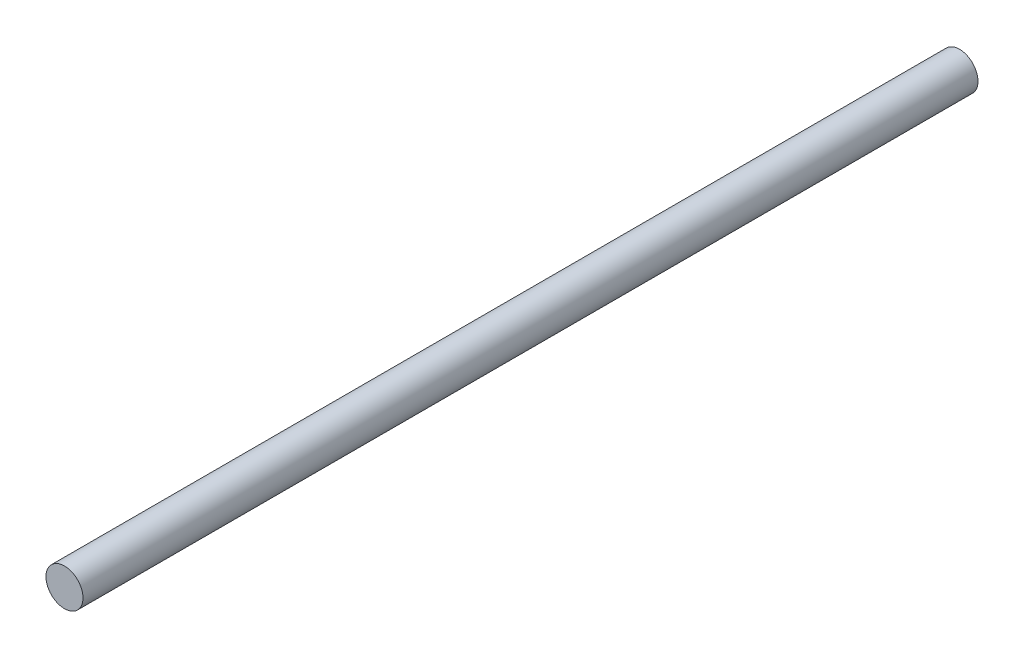
ISO-10303-21;
HEADER;
FILE_DESCRIPTION(('STEP AP214'),'2;1');
FILE_NAME('part.step','',(''),(''),'','','');
FILE_SCHEMA(('AUTOMOTIVE_DESIGN { 1 0 10303 214 1 1 1 1 }'));
ENDSEC;
DATA;
#1=APPLICATION_CONTEXT('core data for automotive mechanical design processes');
#2=APPLICATION_PROTOCOL_DEFINITION('international standard','automotive_design',2000,#1);
#3=PRODUCT_CONTEXT('',#1,'mechanical');
#4=PRODUCT('Part','Part','',(#3));
#5=PRODUCT_RELATED_PRODUCT_CATEGORY('part','',(#4));
#6=PRODUCT_DEFINITION_FORMATION('','',#4);
#7=PRODUCT_DEFINITION_CONTEXT('part definition',#1,'design');
#8=PRODUCT_DEFINITION('design','',#6,#7);
#9=PRODUCT_DEFINITION_SHAPE('','',#8);
#10=(LENGTH_UNIT() NAMED_UNIT(*) SI_UNIT(.MILLI.,.METRE.));
#11=(NAMED_UNIT(*) PLANE_ANGLE_UNIT() SI_UNIT($,.RADIAN.));
#12=(NAMED_UNIT(*) SI_UNIT($,.STERADIAN.) SOLID_ANGLE_UNIT());
#13=UNCERTAINTY_MEASURE_WITH_UNIT(LENGTH_MEASURE(1.E-05),#10,'distance_accuracy_value','');
#14=(GEOMETRIC_REPRESENTATION_CONTEXT(3) GLOBAL_UNCERTAINTY_ASSIGNED_CONTEXT((#13)) GLOBAL_UNIT_ASSIGNED_CONTEXT((#10,
#11,#12)) REPRESENTATION_CONTEXT('',''));
#15=CARTESIAN_POINT('',(0.,0.,0.));
#16=DIRECTION('',(0.,0.,1.));
#17=DIRECTION('',(1.,0.,0.));
#18=AXIS2_PLACEMENT_3D('',#15,#16,#17);
#19=CARTESIAN_POINT('',(0.,0.,290.));
#20=DIRECTION('',(0.,0.,-1.));
#21=DIRECTION('',(-1.,0.,0.));
#22=AXIS2_PLACEMENT_3D('',#19,#20,#21);
#23=CYLINDRICAL_SURFACE('',#22,6.);
#24=CARTESIAN_POINT('',(0.,0.,290.));
#25=DIRECTION('',(0.,0.,1.));
#26=DIRECTION('',(1.,0.,0.));
#27=AXIS2_PLACEMENT_3D('',#24,#25,#26);
#28=CIRCLE('',#27,6.);
#29=CARTESIAN_POINT('',(6.,0.,290.));
#30=VERTEX_POINT('',#29);
#31=EDGE_CURVE('E10',#30,#30,#28,.T.);
#32=ORIENTED_EDGE('',*,*,#31,.F.);
#33=EDGE_LOOP('',(#32));
#34=FACE_BOUND('',#33,.T.);
#35=CARTESIAN_POINT('',(0.,0.,0.));
#36=DIRECTION('',(0.,0.,1.));
#37=DIRECTION('',(1.,0.,0.));
#38=AXIS2_PLACEMENT_3D('',#35,#36,#37);
#39=CIRCLE('',#38,6.);
#40=CARTESIAN_POINT('',(6.,0.,0.));
#41=VERTEX_POINT('',#40);
#42=EDGE_CURVE('E40',#41,#41,#39,.T.);
#43=ORIENTED_EDGE('',*,*,#42,.T.);
#44=EDGE_LOOP('',(#43));
#45=FACE_BOUND('',#44,.T.);
#46=ADVANCED_FACE('F37',(#34,#45),#23,.T.);
#47=CARTESIAN_POINT('',(0.,0.,290.));
#48=DIRECTION('',(0.,0.,1.));
#49=DIRECTION('',(1.,0.,0.));
#50=AXIS2_PLACEMENT_3D('',#47,#48,#49);
#51=PLANE('',#50);
#52=ORIENTED_EDGE('',*,*,#31,.T.);
#53=EDGE_LOOP('',(#52));
#54=FACE_BOUND('',#53,.T.);
#55=ADVANCED_FACE('F52',(#54),#51,.T.);
#56=CARTESIAN_POINT('',(0.,0.,0.));
#57=DIRECTION('',(0.,0.,1.));
#58=DIRECTION('',(1.,0.,0.));
#59=AXIS2_PLACEMENT_3D('',#56,#57,#58);
#60=PLANE('',#59);
#61=ORIENTED_EDGE('',*,*,#42,.F.);
#62=EDGE_LOOP('',(#61));
#63=FACE_BOUND('',#62,.T.);
#64=ADVANCED_FACE('F50',(#63),#60,.F.);
#65=CLOSED_SHELL('',(#46,#55,#64));
#66=MANIFOLD_SOLID_BREP('B2',#65);
#67=ADVANCED_BREP_SHAPE_REPRESENTATION('',(#18,#66),#14);
#68=SHAPE_DEFINITION_REPRESENTATION(#9,#67);
ENDSEC;
END-ISO-10303-21;
